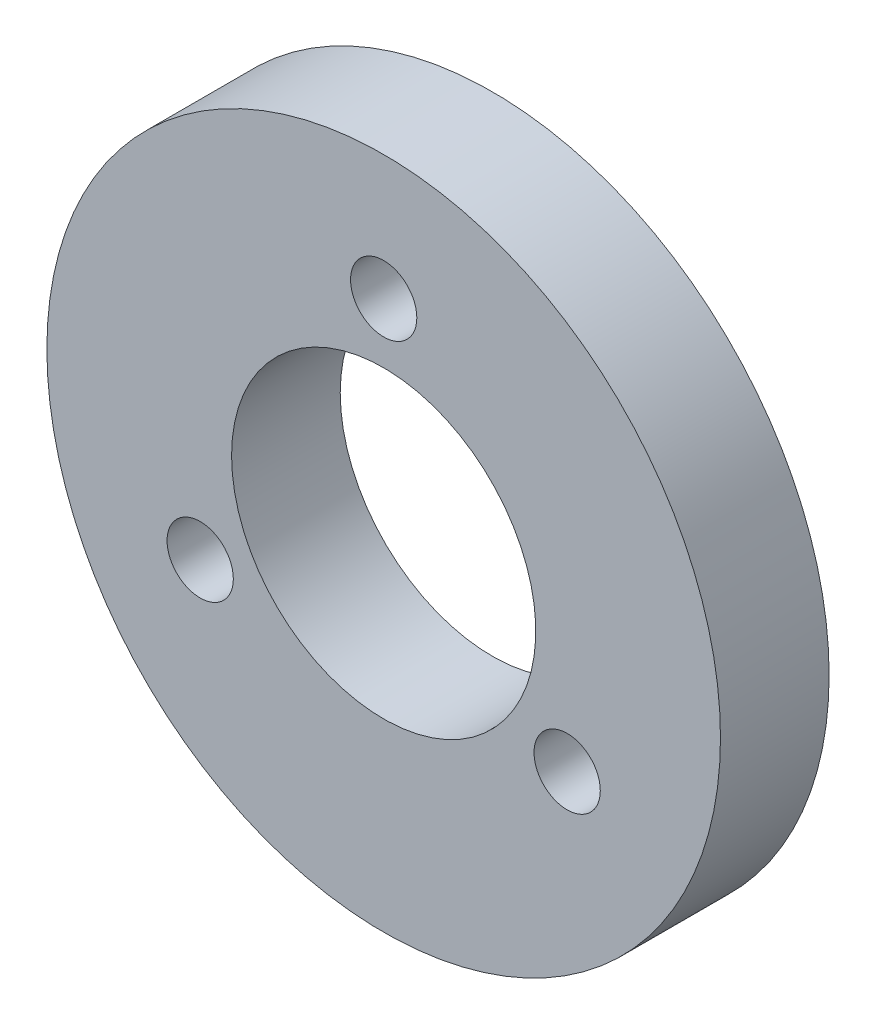
ISO-10303-21;
HEADER;
FILE_DESCRIPTION(('STEP AP214'),'2;1');
FILE_NAME('part.step','',(''),(''),'','','');
FILE_SCHEMA(('AUTOMOTIVE_DESIGN { 1 0 10303 214 1 1 1 1 }'));
ENDSEC;
DATA;
#1=APPLICATION_CONTEXT('core data for automotive mechanical design processes');
#2=APPLICATION_PROTOCOL_DEFINITION('international standard','automotive_design',2000,#1);
#3=PRODUCT_CONTEXT('',#1,'mechanical');
#4=PRODUCT('Part','Part','',(#3));
#5=PRODUCT_RELATED_PRODUCT_CATEGORY('part','',(#4));
#6=PRODUCT_DEFINITION_FORMATION('','',#4);
#7=PRODUCT_DEFINITION_CONTEXT('part definition',#1,'design');
#8=PRODUCT_DEFINITION('design','',#6,#7);
#9=PRODUCT_DEFINITION_SHAPE('','',#8);
#10=(LENGTH_UNIT() NAMED_UNIT(*) SI_UNIT(.MILLI.,.METRE.));
#11=(NAMED_UNIT(*) PLANE_ANGLE_UNIT() SI_UNIT($,.RADIAN.));
#12=(NAMED_UNIT(*) SI_UNIT($,.STERADIAN.) SOLID_ANGLE_UNIT());
#13=UNCERTAINTY_MEASURE_WITH_UNIT(LENGTH_MEASURE(1.E-05),#10,'distance_accuracy_value','');
#14=(GEOMETRIC_REPRESENTATION_CONTEXT(3) GLOBAL_UNCERTAINTY_ASSIGNED_CONTEXT((#13)) GLOBAL_UNIT_ASSIGNED_CONTEXT((#10,
#11,#12)) REPRESENTATION_CONTEXT('',''));
#15=CARTESIAN_POINT('',(0.,0.,0.));
#16=DIRECTION('',(0.,0.,1.));
#17=DIRECTION('',(1.,0.,0.));
#18=AXIS2_PLACEMENT_3D('',#15,#16,#17);
#19=CARTESIAN_POINT('',(0.,0.,5.));
#20=DIRECTION('',(0.,0.,0.999999999999999));
#21=DIRECTION('',(1.,0.,0.));
#22=AXIS2_PLACEMENT_3D('',#19,#20,#21);
#23=PLANE('',#22);
#24=CARTESIAN_POINT('',(2.22044604925031E-13,9.75000000000008,5.00000000000006));
#25=DIRECTION('',(0.,0.,0.999999999999999));
#26=DIRECTION('',(1.,0.,0.));
#27=AXIS2_PLACEMENT_3D('',#24,#25,#26);
#28=CIRCLE('',#27,1.525);
#29=CARTESIAN_POINT('',(1.525,9.75000000000004,5.00000000000006));
#30=VERTEX_POINT('',#29);
#31=EDGE_CURVE('E59',#30,#30,#28,.T.);
#32=ORIENTED_EDGE('',*,*,#31,.F.);
#33=EDGE_LOOP('',(#32));
#34=FACE_BOUND('',#33,.T.);
#35=CARTESIAN_POINT('',(8.44374768689893,-4.8749999999997,5.));
#36=DIRECTION('',(0.,0.,0.999999999999999));
#37=DIRECTION('',(1.,0.,0.));
#38=AXIS2_PLACEMENT_3D('',#35,#36,#37);
#39=CIRCLE('',#38,1.52500000000053);
#40=CARTESIAN_POINT('',(9.96874768689946,-4.87499999999969,5.));
#41=VERTEX_POINT('',#40);
#42=EDGE_CURVE('E52',#41,#41,#39,.T.);
#43=ORIENTED_EDGE('',*,*,#42,.F.);
#44=EDGE_LOOP('',(#43));
#45=FACE_BOUND('',#44,.T.);
#46=CARTESIAN_POINT('',(-8.44374768689771,-4.87500000000031,5.00000000000012));
#47=DIRECTION('',(0.,0.,0.999999999999999));
#48=DIRECTION('',(1.,0.,0.));
#49=AXIS2_PLACEMENT_3D('',#46,#47,#48);
#50=CIRCLE('',#49,1.52500000000079);
#51=CARTESIAN_POINT('',(-6.91874768689714,-4.87500000000041,5.00000000000012));
#52=VERTEX_POINT('',#51);
#53=EDGE_CURVE('E53',#52,#52,#50,.T.);
#54=ORIENTED_EDGE('',*,*,#53,.F.);
#55=EDGE_LOOP('',(#54));
#56=FACE_BOUND('',#55,.T.);
#57=CARTESIAN_POINT('',(0.,0.,5.));
#58=DIRECTION('',(0.,0.,0.999999999999999));
#59=DIRECTION('',(1.,0.,0.));
#60=AXIS2_PLACEMENT_3D('',#57,#58,#59);
#61=CIRCLE('',#60,15.5);
#62=CARTESIAN_POINT('',(-15.5,0.,5.00000000000001));
#63=VERTEX_POINT('',#62);
#64=EDGE_CURVE('E10',#63,#63,#61,.T.);
#65=ORIENTED_EDGE('',*,*,#64,.T.);
#66=EDGE_LOOP('',(#65));
#67=FACE_BOUND('',#66,.T.);
#68=CARTESIAN_POINT('',(0.,0.,5.));
#69=DIRECTION('',(0.,0.,0.999999999999999));
#70=DIRECTION('',(1.,0.,0.));
#71=AXIS2_PLACEMENT_3D('',#68,#69,#70);
#72=CIRCLE('',#71,7.);
#73=CARTESIAN_POINT('',(-7.,0.,5.));
#74=VERTEX_POINT('',#73);
#75=EDGE_CURVE('E41',#74,#74,#72,.T.);
#76=ORIENTED_EDGE('',*,*,#75,.F.);
#77=EDGE_LOOP('',(#76));
#78=FACE_BOUND('',#77,.T.);
#79=ADVANCED_FACE('F30',(#34,#45,#56,#67,#78),#23,.T.);
#80=CARTESIAN_POINT('',(0.,0.,0.));
#81=DIRECTION('',(0.,0.,0.999999999999999));
#82=DIRECTION('',(1.,0.,0.));
#83=AXIS2_PLACEMENT_3D('',#80,#81,#82);
#84=PLANE('',#83);
#85=CARTESIAN_POINT('',(0.,9.75000000000004,1.11022302462516E-13));
#86=DIRECTION('',(0.,0.,0.999999999999999));
#87=DIRECTION('',(1.,0.,0.));
#88=AXIS2_PLACEMENT_3D('',#85,#86,#87);
#89=CIRCLE('',#88,1.525);
#90=CARTESIAN_POINT('',(1.525,9.75000000000004,1.11022302462516E-13));
#91=VERTEX_POINT('',#90);
#92=EDGE_CURVE('E46',#91,#91,#89,.F.);
#93=ORIENTED_EDGE('',*,*,#92,.F.);
#94=EDGE_LOOP('',(#93));
#95=FACE_BOUND('',#94,.T.);
#96=CARTESIAN_POINT('',(8.44374768689893,-4.87499999999969,0.));
#97=DIRECTION('',(0.,0.,0.999999999999999));
#98=DIRECTION('',(1.,0.,0.));
#99=AXIS2_PLACEMENT_3D('',#96,#97,#98);
#100=CIRCLE('',#99,1.52500000000053);
#101=CARTESIAN_POINT('',(9.96874768689946,-4.87499999999969,0.));
#102=VERTEX_POINT('',#101);
#103=EDGE_CURVE('E56',#102,#102,#100,.F.);
#104=ORIENTED_EDGE('',*,*,#103,.F.);
#105=EDGE_LOOP('',(#104));
#106=FACE_BOUND('',#105,.T.);
#107=CARTESIAN_POINT('',(-8.44374768689793,-4.87500000000041,1.11022302462516E-13));
#108=DIRECTION('',(0.,0.,0.999999999999999));
#109=DIRECTION('',(1.,0.,0.));
#110=AXIS2_PLACEMENT_3D('',#107,#108,#109);
#111=CIRCLE('',#110,1.52500000000079);
#112=CARTESIAN_POINT('',(-6.91874768689714,-4.87500000000041,1.11022302462516E-13));
#113=VERTEX_POINT('',#112);
#114=EDGE_CURVE('E49',#113,#113,#111,.F.);
#115=ORIENTED_EDGE('',*,*,#114,.F.);
#116=EDGE_LOOP('',(#115));
#117=FACE_BOUND('',#116,.T.);
#118=CARTESIAN_POINT('',(0.,0.,0.));
#119=DIRECTION('',(0.,0.,0.999999999999999));
#120=DIRECTION('',(1.,0.,0.));
#121=AXIS2_PLACEMENT_3D('',#118,#119,#120);
#122=CIRCLE('',#121,15.5);
#123=CARTESIAN_POINT('',(-15.5,0.,0.));
#124=VERTEX_POINT('',#123);
#125=EDGE_CURVE('E34',#124,#124,#122,.T.);
#126=ORIENTED_EDGE('',*,*,#125,.F.);
#127=EDGE_LOOP('',(#126));
#128=FACE_BOUND('',#127,.T.);
#129=CARTESIAN_POINT('',(0.,0.,0.));
#130=DIRECTION('',(0.,0.,0.999999999999999));
#131=DIRECTION('',(1.,0.,0.));
#132=AXIS2_PLACEMENT_3D('',#129,#130,#131);
#133=CIRCLE('',#132,7.);
#134=CARTESIAN_POINT('',(-7.,0.,0.));
#135=VERTEX_POINT('',#134);
#136=EDGE_CURVE('E43',#135,#135,#133,.T.);
#137=ORIENTED_EDGE('',*,*,#136,.T.);
#138=EDGE_LOOP('',(#137));
#139=FACE_BOUND('',#138,.T.);
#140=ADVANCED_FACE('F72',(#95,#106,#117,#128,#139),#84,.F.);
#141=CARTESIAN_POINT('',(0.,0.,5.));
#142=DIRECTION('',(0.,0.,-0.999999999999999));
#143=DIRECTION('',(-1.,0.,0.));
#144=AXIS2_PLACEMENT_3D('',#141,#142,#143);
#145=CYLINDRICAL_SURFACE('',#144,15.5);
#146=CARTESIAN_POINT('',(-15.5,0.,5.00000000000001));
#147=CARTESIAN_POINT('',(-15.5,0.,4.94791666666667));
#148=CARTESIAN_POINT('',(-15.5,0.,4.89583333333334));
#149=CARTESIAN_POINT('',(-15.5,0.,4.79166666666667));
#150=CARTESIAN_POINT('',(-15.5,0.,4.73958333333334));
#151=CARTESIAN_POINT('',(-15.5,0.,4.63541666666667));
#152=CARTESIAN_POINT('',(-15.5,0.,4.58333333333334));
#153=CARTESIAN_POINT('',(-15.5,0.,4.47916666666667));
#154=CARTESIAN_POINT('',(-15.5,0.,4.42708333333334));
#155=CARTESIAN_POINT('',(-15.5,0.,4.32291666666667));
#156=CARTESIAN_POINT('',(-15.5,0.,4.27083333333334));
#157=CARTESIAN_POINT('',(-15.5,0.,4.16666666666667));
#158=CARTESIAN_POINT('',(-15.5,0.,4.11458333333334));
#159=CARTESIAN_POINT('',(-15.5,0.,4.01041666666667));
#160=CARTESIAN_POINT('',(-15.5,0.,3.95833333333334));
#161=CARTESIAN_POINT('',(-15.5,0.,3.85416666666667));
#162=CARTESIAN_POINT('',(-15.5,0.,3.80208333333334));
#163=CARTESIAN_POINT('',(-15.5,0.,3.69791666666667));
#164=CARTESIAN_POINT('',(-15.5,0.,3.64583333333334));
#165=CARTESIAN_POINT('',(-15.5,0.,3.54166666666667));
#166=CARTESIAN_POINT('',(-15.5,0.,3.48958333333334));
#167=CARTESIAN_POINT('',(-15.5,0.,3.38541666666667));
#168=CARTESIAN_POINT('',(-15.5,0.,3.33333333333334));
#169=CARTESIAN_POINT('',(-15.5,0.,3.22916666666667));
#170=CARTESIAN_POINT('',(-15.5,0.,3.17708333333334));
#171=CARTESIAN_POINT('',(-15.5,0.,3.07291666666667));
#172=CARTESIAN_POINT('',(-15.5,0.,3.02083333333334));
#173=CARTESIAN_POINT('',(-15.5,0.,2.91666666666667));
#174=CARTESIAN_POINT('',(-15.5,0.,2.86458333333334));
#175=CARTESIAN_POINT('',(-15.5,0.,2.76041666666667));
#176=CARTESIAN_POINT('',(-15.5,0.,2.70833333333334));
#177=CARTESIAN_POINT('',(-15.5,0.,2.60416666666667));
#178=CARTESIAN_POINT('',(-15.5,0.,2.55208333333334));
#179=CARTESIAN_POINT('',(-15.5,0.,2.44791666666667));
#180=CARTESIAN_POINT('',(-15.5,0.,2.39583333333334));
#181=CARTESIAN_POINT('',(-15.5,0.,2.29166666666667));
#182=CARTESIAN_POINT('',(-15.5,0.,2.23958333333334));
#183=CARTESIAN_POINT('',(-15.5,0.,2.13541666666667));
#184=CARTESIAN_POINT('',(-15.5,0.,2.08333333333334));
#185=CARTESIAN_POINT('',(-15.5,0.,1.97916666666667));
#186=CARTESIAN_POINT('',(-15.5,0.,1.92708333333333));
#187=CARTESIAN_POINT('',(-15.5,0.,1.82291666666667));
#188=CARTESIAN_POINT('',(-15.5,0.,1.77083333333333));
#189=CARTESIAN_POINT('',(-15.5,0.,1.66666666666667));
#190=CARTESIAN_POINT('',(-15.5,0.,1.61458333333333));
#191=CARTESIAN_POINT('',(-15.5,0.,1.51041666666667));
#192=CARTESIAN_POINT('',(-15.5,0.,1.45833333333333));
#193=CARTESIAN_POINT('',(-15.5,0.,1.35416666666667));
#194=CARTESIAN_POINT('',(-15.5,0.,1.30208333333333));
#195=CARTESIAN_POINT('',(-15.5,0.,1.19791666666667));
#196=CARTESIAN_POINT('',(-15.5,0.,1.14583333333333));
#197=CARTESIAN_POINT('',(-15.5,0.,1.04166666666667));
#198=CARTESIAN_POINT('',(-15.5,0.,0.989583333333334));
#199=CARTESIAN_POINT('',(-15.5,0.,0.885416666666667));
#200=CARTESIAN_POINT('',(-15.5,0.,0.833333333333333));
#201=CARTESIAN_POINT('',(-15.5,0.,0.729166666666667));
#202=CARTESIAN_POINT('',(-15.5,0.,0.677083333333334));
#203=CARTESIAN_POINT('',(-15.5,0.,0.572916666666667));
#204=CARTESIAN_POINT('',(-15.5,0.,0.520833333333334));
#205=CARTESIAN_POINT('',(-15.5,0.,0.416666666666667));
#206=CARTESIAN_POINT('',(-15.5,0.,0.364583333333334));
#207=CARTESIAN_POINT('',(-15.5,0.,0.260416666666667));
#208=CARTESIAN_POINT('',(-15.5,0.,0.208333333333333));
#209=CARTESIAN_POINT('',(-15.5,0.,0.104166666666666));
#210=CARTESIAN_POINT('',(-15.5,0.,0.0520833333333331));
#211=CARTESIAN_POINT('',(-15.5,0.,0.));
#212=B_SPLINE_CURVE_WITH_KNOTS('',3,(#146,#147,#148,#149,#150,#151,#152,#153,#154,#155,#156,
#157,#158,#159,#160,#161,#162,#163,#164,#165,#166,#167,#168,#169,#170,#171,#172,#173,#174,#175,
#176,#177,#178,#179,#180,#181,#182,#183,#184,#185,#186,#187,#188,#189,#190,#191,#192,#193,#194,
#195,#196,#197,#198,#199,#200,#201,#202,#203,#204,#205,#206,#207,#208,#209,#210,#211),
.UNSPECIFIED.,.F.,.F.,(4,2,2,2,2,2,2,2,2,2,2,2,2,2,2,2,2,2,2,2,2,2,2,2,2,2,2,2,2,2,2,2,4),(0.,
0.156250000000001,0.312500000000001,0.468750000000001,0.625000000000001,0.781250000000002,
0.937500000000002,1.09375,1.25,1.40625,1.5625,1.71875,1.875,2.03125,2.1875,2.34375,2.5,2.65625,
2.8125,2.96875,3.125,3.28125,3.4375,3.59375,3.75,3.90625,4.0625,4.21875000000001,4.375,
4.53125000000001,4.68750000000001,4.84375000000001,5.00000000000001),.UNSPECIFIED.);
#213=EDGE_CURVE('BSEAM32',#63,#124,#212,.T.);
#214=ORIENTED_EDGE('',*,*,#64,.F.);
#215=ORIENTED_EDGE('',*,*,#125,.T.);
#216=ORIENTED_EDGE('',*,*,#213,.T.);
#217=ORIENTED_EDGE('',*,*,#213,.F.);
#218=EDGE_LOOP('',(#214,#216,#215,#217));
#219=FACE_BOUND('',#218,.T.);
#220=ADVANCED_FACE('F32',(#219),#145,.T.);
#221=CARTESIAN_POINT('',(0.,0.,5.));
#222=DIRECTION('',(0.,0.,-0.999999999999999));
#223=DIRECTION('',(-1.,0.,0.));
#224=AXIS2_PLACEMENT_3D('',#221,#222,#223);
#225=CYLINDRICAL_SURFACE('',#224,7.);
#226=CARTESIAN_POINT('',(-7.,0.,5.));
#227=CARTESIAN_POINT('',(-7.,0.,4.94791666666667));
#228=CARTESIAN_POINT('',(-7.,0.,4.89583333333334));
#229=CARTESIAN_POINT('',(-7.,0.,4.79166666666667));
#230=CARTESIAN_POINT('',(-7.,0.,4.73958333333334));
#231=CARTESIAN_POINT('',(-7.,0.,4.63541666666667));
#232=CARTESIAN_POINT('',(-7.,0.,4.58333333333334));
#233=CARTESIAN_POINT('',(-7.,0.,4.47916666666667));
#234=CARTESIAN_POINT('',(-7.,0.,4.42708333333334));
#235=CARTESIAN_POINT('',(-7.,0.,4.32291666666667));
#236=CARTESIAN_POINT('',(-7.,0.,4.27083333333334));
#237=CARTESIAN_POINT('',(-7.,0.,4.16666666666667));
#238=CARTESIAN_POINT('',(-7.,0.,4.11458333333334));
#239=CARTESIAN_POINT('',(-7.,0.,4.01041666666667));
#240=CARTESIAN_POINT('',(-7.,0.,3.95833333333334));
#241=CARTESIAN_POINT('',(-7.,0.,3.85416666666667));
#242=CARTESIAN_POINT('',(-7.,0.,3.80208333333334));
#243=CARTESIAN_POINT('',(-7.,0.,3.69791666666667));
#244=CARTESIAN_POINT('',(-7.,0.,3.64583333333334));
#245=CARTESIAN_POINT('',(-7.,0.,3.54166666666667));
#246=CARTESIAN_POINT('',(-7.,0.,3.48958333333334));
#247=CARTESIAN_POINT('',(-7.,0.,3.38541666666667));
#248=CARTESIAN_POINT('',(-7.,0.,3.33333333333334));
#249=CARTESIAN_POINT('',(-7.,0.,3.22916666666667));
#250=CARTESIAN_POINT('',(-7.,0.,3.17708333333334));
#251=CARTESIAN_POINT('',(-7.,0.,3.07291666666667));
#252=CARTESIAN_POINT('',(-7.,0.,3.02083333333334));
#253=CARTESIAN_POINT('',(-7.,0.,2.91666666666667));
#254=CARTESIAN_POINT('',(-7.,0.,2.86458333333334));
#255=CARTESIAN_POINT('',(-7.,0.,2.76041666666667));
#256=CARTESIAN_POINT('',(-7.,0.,2.70833333333334));
#257=CARTESIAN_POINT('',(-7.,0.,2.60416666666667));
#258=CARTESIAN_POINT('',(-7.,0.,2.55208333333334));
#259=CARTESIAN_POINT('',(-7.,0.,2.44791666666667));
#260=CARTESIAN_POINT('',(-7.,0.,2.39583333333334));
#261=CARTESIAN_POINT('',(-7.,0.,2.29166666666667));
#262=CARTESIAN_POINT('',(-7.,0.,2.23958333333334));
#263=CARTESIAN_POINT('',(-7.,0.,2.13541666666667));
#264=CARTESIAN_POINT('',(-7.,0.,2.08333333333334));
#265=CARTESIAN_POINT('',(-7.,0.,1.97916666666667));
#266=CARTESIAN_POINT('',(-7.,0.,1.92708333333334));
#267=CARTESIAN_POINT('',(-7.,0.,1.82291666666667));
#268=CARTESIAN_POINT('',(-7.,0.,1.77083333333334));
#269=CARTESIAN_POINT('',(-7.,0.,1.66666666666667));
#270=CARTESIAN_POINT('',(-7.,0.,1.61458333333334));
#271=CARTESIAN_POINT('',(-7.,0.,1.51041666666667));
#272=CARTESIAN_POINT('',(-7.,0.,1.45833333333333));
#273=CARTESIAN_POINT('',(-7.,0.,1.35416666666667));
#274=CARTESIAN_POINT('',(-7.,0.,1.30208333333333));
#275=CARTESIAN_POINT('',(-7.,0.,1.19791666666667));
#276=CARTESIAN_POINT('',(-7.,0.,1.14583333333333));
#277=CARTESIAN_POINT('',(-7.,0.,1.04166666666667));
#278=CARTESIAN_POINT('',(-7.,0.,0.989583333333334));
#279=CARTESIAN_POINT('',(-7.,0.,0.885416666666667));
#280=CARTESIAN_POINT('',(-7.,0.,0.833333333333333));
#281=CARTESIAN_POINT('',(-7.,0.,0.729166666666667));
#282=CARTESIAN_POINT('',(-7.,0.,0.677083333333334));
#283=CARTESIAN_POINT('',(-7.,0.,0.572916666666667));
#284=CARTESIAN_POINT('',(-7.,0.,0.520833333333334));
#285=CARTESIAN_POINT('',(-7.,0.,0.416666666666667));
#286=CARTESIAN_POINT('',(-7.,0.,0.364583333333333));
#287=CARTESIAN_POINT('',(-7.,0.,0.260416666666666));
#288=CARTESIAN_POINT('',(-7.,0.,0.208333333333333));
#289=CARTESIAN_POINT('',(-7.,0.,0.104166666666666));
#290=CARTESIAN_POINT('',(-7.,0.,0.052083333333333));
#291=CARTESIAN_POINT('',(-7.,0.,0.));
#292=B_SPLINE_CURVE_WITH_KNOTS('',3,(#226,#227,#228,#229,#230,#231,#232,#233,#234,#235,#236,
#237,#238,#239,#240,#241,#242,#243,#244,#245,#246,#247,#248,#249,#250,#251,#252,#253,#254,#255,
#256,#257,#258,#259,#260,#261,#262,#263,#264,#265,#266,#267,#268,#269,#270,#271,#272,#273,#274,
#275,#276,#277,#278,#279,#280,#281,#282,#283,#284,#285,#286,#287,#288,#289,#290,#291),
.UNSPECIFIED.,.F.,.F.,(4,2,2,2,2,2,2,2,2,2,2,2,2,2,2,2,2,2,2,2,2,2,2,2,2,2,2,2,2,2,2,2,4),(0.,
0.15625,0.3125,0.46875,0.625000000000001,0.781250000000001,0.937500000000001,1.09375,1.25,
1.40625,1.5625,1.71875,1.875,2.03125,2.1875,2.34375,2.5,2.65625,2.8125,2.96875,3.125,3.28125,
3.4375,3.59375,3.75,3.90625,4.0625,4.21875,4.375,4.53125,4.68750000000001,4.84375000000001,5.),.UNSPECIFIED.);
#293=EDGE_CURVE('BSEAM80',#74,#135,#292,.T.);
#294=ORIENTED_EDGE('',*,*,#75,.T.);
#295=ORIENTED_EDGE('',*,*,#136,.F.);
#296=ORIENTED_EDGE('',*,*,#293,.T.);
#297=ORIENTED_EDGE('',*,*,#293,.F.);
#298=EDGE_LOOP('',(#294,#296,#295,#297));
#299=FACE_BOUND('',#298,.T.);
#300=ADVANCED_FACE('F80',(#299),#225,.F.);
#301=CARTESIAN_POINT('',(-8.44374768689793,-4.87500000000041,-0.000999999999917733));
#302=DIRECTION('',(0.,0.,0.999999999999999));
#303=DIRECTION('',(1.,0.,0.));
#304=AXIS2_PLACEMENT_3D('',#301,#302,#303);
#305=CYLINDRICAL_SURFACE('',#304,1.52500000000079);
#306=CARTESIAN_POINT('',(-6.91874768689714,-4.87500000000041,5.00000000000012));
#307=CARTESIAN_POINT('',(-6.91874768689714,-4.87500000000041,4.94791666666678));
#308=CARTESIAN_POINT('',(-6.91874768689714,-4.87500000000041,4.89583333333345));
#309=CARTESIAN_POINT('',(-6.91874768689714,-4.87500000000041,4.79166666666678));
#310=CARTESIAN_POINT('',(-6.91874768689714,-4.87500000000041,4.73958333333345));
#311=CARTESIAN_POINT('',(-6.91874768689714,-4.87500000000041,4.63541666666678));
#312=CARTESIAN_POINT('',(-6.91874768689714,-4.87500000000041,4.58333333333345));
#313=CARTESIAN_POINT('',(-6.91874768689714,-4.87500000000041,4.47916666666678));
#314=CARTESIAN_POINT('',(-6.91874768689714,-4.87500000000041,4.42708333333345));
#315=CARTESIAN_POINT('',(-6.91874768689714,-4.87500000000041,4.32291666666678));
#316=CARTESIAN_POINT('',(-6.91874768689714,-4.87500000000041,4.27083333333345));
#317=CARTESIAN_POINT('',(-6.91874768689714,-4.87500000000041,4.16666666666678));
#318=CARTESIAN_POINT('',(-6.91874768689714,-4.87500000000041,4.11458333333345));
#319=CARTESIAN_POINT('',(-6.91874768689714,-4.87500000000041,4.01041666666678));
#320=CARTESIAN_POINT('',(-6.91874768689714,-4.87500000000041,3.95833333333345));
#321=CARTESIAN_POINT('',(-6.91874768689714,-4.87500000000041,3.85416666666678));
#322=CARTESIAN_POINT('',(-6.91874768689714,-4.87500000000041,3.80208333333345));
#323=CARTESIAN_POINT('',(-6.91874768689714,-4.87500000000041,3.69791666666678));
#324=CARTESIAN_POINT('',(-6.91874768689714,-4.87500000000041,3.64583333333345));
#325=CARTESIAN_POINT('',(-6.91874768689714,-4.87500000000041,3.54166666666678));
#326=CARTESIAN_POINT('',(-6.91874768689714,-4.87500000000041,3.48958333333345));
#327=CARTESIAN_POINT('',(-6.91874768689714,-4.87500000000041,3.38541666666678));
#328=CARTESIAN_POINT('',(-6.91874768689714,-4.87500000000041,3.33333333333345));
#329=CARTESIAN_POINT('',(-6.91874768689714,-4.87500000000041,3.22916666666678));
#330=CARTESIAN_POINT('',(-6.91874768689714,-4.87500000000041,3.17708333333345));
#331=CARTESIAN_POINT('',(-6.91874768689714,-4.87500000000041,3.07291666666678));
#332=CARTESIAN_POINT('',(-6.91874768689714,-4.87500000000041,3.02083333333345));
#333=CARTESIAN_POINT('',(-6.91874768689714,-4.87500000000041,2.91666666666678));
#334=CARTESIAN_POINT('',(-6.91874768689714,-4.87500000000041,2.86458333333345));
#335=CARTESIAN_POINT('',(-6.91874768689714,-4.87500000000041,2.76041666666678));
#336=CARTESIAN_POINT('',(-6.91874768689714,-4.87500000000041,2.70833333333345));
#337=CARTESIAN_POINT('',(-6.91874768689714,-4.87500000000041,2.60416666666678));
#338=CARTESIAN_POINT('',(-6.91874768689714,-4.87500000000041,2.55208333333345));
#339=CARTESIAN_POINT('',(-6.91874768689714,-4.87500000000041,2.44791666666678));
#340=CARTESIAN_POINT('',(-6.91874768689714,-4.87500000000041,2.39583333333345));
#341=CARTESIAN_POINT('',(-6.91874768689714,-4.87500000000041,2.29166666666678));
#342=CARTESIAN_POINT('',(-6.91874768689714,-4.87500000000041,2.23958333333345));
#343=CARTESIAN_POINT('',(-6.91874768689714,-4.87500000000041,2.13541666666678));
#344=CARTESIAN_POINT('',(-6.91874768689714,-4.87500000000041,2.08333333333345));
#345=CARTESIAN_POINT('',(-6.91874768689714,-4.87500000000041,1.97916666666678));
#346=CARTESIAN_POINT('',(-6.91874768689714,-4.87500000000041,1.92708333333345));
#347=CARTESIAN_POINT('',(-6.91874768689714,-4.87500000000041,1.82291666666678));
#348=CARTESIAN_POINT('',(-6.91874768689714,-4.87500000000041,1.77083333333345));
#349=CARTESIAN_POINT('',(-6.91874768689714,-4.87500000000041,1.66666666666678));
#350=CARTESIAN_POINT('',(-6.91874768689714,-4.87500000000041,1.61458333333345));
#351=CARTESIAN_POINT('',(-6.91874768689714,-4.87500000000041,1.51041666666678));
#352=CARTESIAN_POINT('',(-6.91874768689714,-4.87500000000041,1.45833333333345));
#353=CARTESIAN_POINT('',(-6.91874768689714,-4.87500000000041,1.35416666666678));
#354=CARTESIAN_POINT('',(-6.91874768689714,-4.87500000000041,1.30208333333345));
#355=CARTESIAN_POINT('',(-6.91874768689714,-4.87500000000041,1.19791666666678));
#356=CARTESIAN_POINT('',(-6.91874768689714,-4.87500000000041,1.14583333333345));
#357=CARTESIAN_POINT('',(-6.91874768689714,-4.87500000000041,1.04166666666678));
#358=CARTESIAN_POINT('',(-6.91874768689714,-4.87500000000041,0.989583333333446));
#359=CARTESIAN_POINT('',(-6.91874768689714,-4.87500000000041,0.885416666666779));
#360=CARTESIAN_POINT('',(-6.91874768689714,-4.87500000000041,0.833333333333445));
#361=CARTESIAN_POINT('',(-6.91874768689714,-4.87500000000041,0.729166666666778));
#362=CARTESIAN_POINT('',(-6.91874768689714,-4.87500000000041,0.677083333333445));
#363=CARTESIAN_POINT('',(-6.91874768689714,-4.87500000000041,0.572916666666778));
#364=CARTESIAN_POINT('',(-6.91874768689714,-4.87500000000041,0.520833333333445));
#365=CARTESIAN_POINT('',(-6.91874768689714,-4.87500000000041,0.416666666666778));
#366=CARTESIAN_POINT('',(-6.91874768689714,-4.87500000000041,0.364583333333444));
#367=CARTESIAN_POINT('',(-6.91874768689714,-4.87500000000041,0.260416666666778));
#368=CARTESIAN_POINT('',(-6.91874768689714,-4.87500000000041,0.208333333333444));
#369=CARTESIAN_POINT('',(-6.91874768689714,-4.87500000000041,0.104166666666778));
#370=CARTESIAN_POINT('',(-6.91874768689714,-4.87500000000041,0.0520833333334444));
#371=CARTESIAN_POINT('',(-6.91874768689714,-4.87500000000041,1.11021031913095E-13));
#372=B_SPLINE_CURVE_WITH_KNOTS('',3,(#306,#307,#308,#309,#310,#311,#312,#313,#314,#315,#316,
#317,#318,#319,#320,#321,#322,#323,#324,#325,#326,#327,#328,#329,#330,#331,#332,#333,#334,#335,
#336,#337,#338,#339,#340,#341,#342,#343,#344,#345,#346,#347,#348,#349,#350,#351,#352,#353,#354,
#355,#356,#357,#358,#359,#360,#361,#362,#363,#364,#365,#366,#367,#368,#369,#370,#371),
.UNSPECIFIED.,.F.,.F.,(4,2,2,2,2,2,2,2,2,2,2,2,2,2,2,2,2,2,2,2,2,2,2,2,2,2,2,2,2,2,2,2,4),(0.,
0.156249999999999,0.312499999999999,0.46875,0.625000000000001,0.78125,0.937500000000001,1.09375,
1.25,1.40625,1.5625,1.71875,1.875,2.03125,2.1875,2.34375,2.5,2.65625,2.8125,2.96875,3.125,
3.28125,3.4375,3.59375,3.75,3.90625,4.0625,4.21875,4.375,4.53125000000001,4.68750000000001,
4.84375000000001,5.00000000000001),.UNSPECIFIED.);
#373=EDGE_CURVE('BSEAM83',#52,#113,#372,.T.);
#374=ORIENTED_EDGE('',*,*,#53,.T.);
#375=ORIENTED_EDGE('',*,*,#114,.T.);
#376=ORIENTED_EDGE('',*,*,#373,.T.);
#377=ORIENTED_EDGE('',*,*,#373,.F.);
#378=EDGE_LOOP('',(#374,#376,#375,#377));
#379=FACE_BOUND('',#378,.T.);
#380=ADVANCED_FACE('F83',(#379),#305,.F.);
#381=CARTESIAN_POINT('',(8.44374768689893,-4.87499999999969,-0.00100000000002876));
#382=DIRECTION('',(0.,0.,0.999999999999999));
#383=DIRECTION('',(1.,0.,0.));
#384=AXIS2_PLACEMENT_3D('',#381,#382,#383);
#385=CYLINDRICAL_SURFACE('',#384,1.52500000000053);
#386=CARTESIAN_POINT('',(9.96874768689946,-4.87499999999969,5.));
#387=CARTESIAN_POINT('',(9.96874768689946,-4.87499999999969,4.94791666666667));
#388=CARTESIAN_POINT('',(9.96874768689946,-4.87499999999969,4.89583333333334));
#389=CARTESIAN_POINT('',(9.96874768689946,-4.87499999999969,4.79166666666667));
#390=CARTESIAN_POINT('',(9.96874768689946,-4.87499999999969,4.73958333333334));
#391=CARTESIAN_POINT('',(9.96874768689946,-4.87499999999969,4.63541666666667));
#392=CARTESIAN_POINT('',(9.96874768689946,-4.87499999999969,4.58333333333334));
#393=CARTESIAN_POINT('',(9.96874768689946,-4.87499999999969,4.47916666666667));
#394=CARTESIAN_POINT('',(9.96874768689946,-4.87499999999969,4.42708333333334));
#395=CARTESIAN_POINT('',(9.96874768689946,-4.87499999999969,4.32291666666667));
#396=CARTESIAN_POINT('',(9.96874768689946,-4.87499999999969,4.27083333333334));
#397=CARTESIAN_POINT('',(9.96874768689946,-4.87499999999969,4.16666666666667));
#398=CARTESIAN_POINT('',(9.96874768689946,-4.87499999999969,4.11458333333334));
#399=CARTESIAN_POINT('',(9.96874768689946,-4.87499999999969,4.01041666666667));
#400=CARTESIAN_POINT('',(9.96874768689946,-4.87499999999969,3.95833333333334));
#401=CARTESIAN_POINT('',(9.96874768689946,-4.87499999999969,3.85416666666667));
#402=CARTESIAN_POINT('',(9.96874768689946,-4.87499999999969,3.80208333333334));
#403=CARTESIAN_POINT('',(9.96874768689946,-4.87499999999969,3.69791666666667));
#404=CARTESIAN_POINT('',(9.96874768689946,-4.87499999999969,3.64583333333334));
#405=CARTESIAN_POINT('',(9.96874768689946,-4.87499999999969,3.54166666666667));
#406=CARTESIAN_POINT('',(9.96874768689946,-4.87499999999969,3.48958333333334));
#407=CARTESIAN_POINT('',(9.96874768689946,-4.87499999999969,3.38541666666667));
#408=CARTESIAN_POINT('',(9.96874768689946,-4.87499999999969,3.33333333333334));
#409=CARTESIAN_POINT('',(9.96874768689946,-4.87499999999969,3.22916666666667));
#410=CARTESIAN_POINT('',(9.96874768689946,-4.87499999999969,3.17708333333334));
#411=CARTESIAN_POINT('',(9.96874768689946,-4.87499999999969,3.07291666666667));
#412=CARTESIAN_POINT('',(9.96874768689946,-4.87499999999969,3.02083333333334));
#413=CARTESIAN_POINT('',(9.96874768689946,-4.87499999999969,2.91666666666667));
#414=CARTESIAN_POINT('',(9.96874768689946,-4.87499999999969,2.86458333333334));
#415=CARTESIAN_POINT('',(9.96874768689946,-4.87499999999969,2.76041666666667));
#416=CARTESIAN_POINT('',(9.96874768689946,-4.87499999999969,2.70833333333334));
#417=CARTESIAN_POINT('',(9.96874768689946,-4.87499999999969,2.60416666666667));
#418=CARTESIAN_POINT('',(9.96874768689946,-4.87499999999969,2.55208333333334));
#419=CARTESIAN_POINT('',(9.96874768689946,-4.87499999999969,2.44791666666667));
#420=CARTESIAN_POINT('',(9.96874768689946,-4.87499999999969,2.39583333333334));
#421=CARTESIAN_POINT('',(9.96874768689946,-4.87499999999969,2.29166666666667));
#422=CARTESIAN_POINT('',(9.96874768689946,-4.87499999999969,2.23958333333334));
#423=CARTESIAN_POINT('',(9.96874768689946,-4.87499999999969,2.13541666666667));
#424=CARTESIAN_POINT('',(9.96874768689946,-4.87499999999969,2.08333333333334));
#425=CARTESIAN_POINT('',(9.96874768689946,-4.87499999999969,1.97916666666667));
#426=CARTESIAN_POINT('',(9.96874768689946,-4.87499999999969,1.92708333333334));
#427=CARTESIAN_POINT('',(9.96874768689946,-4.87499999999969,1.82291666666667));
#428=CARTESIAN_POINT('',(9.96874768689946,-4.87499999999969,1.77083333333334));
#429=CARTESIAN_POINT('',(9.96874768689946,-4.87499999999969,1.66666666666667));
#430=CARTESIAN_POINT('',(9.96874768689946,-4.87499999999969,1.61458333333333));
#431=CARTESIAN_POINT('',(9.96874768689946,-4.87499999999969,1.51041666666667));
#432=CARTESIAN_POINT('',(9.96874768689946,-4.87499999999969,1.45833333333333));
#433=CARTESIAN_POINT('',(9.96874768689946,-4.87499999999969,1.35416666666667));
#434=CARTESIAN_POINT('',(9.96874768689946,-4.87499999999969,1.30208333333333));
#435=CARTESIAN_POINT('',(9.96874768689946,-4.87499999999969,1.19791666666667));
#436=CARTESIAN_POINT('',(9.96874768689946,-4.87499999999969,1.14583333333333));
#437=CARTESIAN_POINT('',(9.96874768689946,-4.87499999999969,1.04166666666667));
#438=CARTESIAN_POINT('',(9.96874768689946,-4.87499999999969,0.989583333333334));
#439=CARTESIAN_POINT('',(9.96874768689946,-4.87499999999969,0.885416666666668));
#440=CARTESIAN_POINT('',(9.96874768689946,-4.87499999999969,0.833333333333334));
#441=CARTESIAN_POINT('',(9.96874768689946,-4.87499999999969,0.729166666666667));
#442=CARTESIAN_POINT('',(9.96874768689946,-4.87499999999969,0.677083333333334));
#443=CARTESIAN_POINT('',(9.96874768689946,-4.87499999999969,0.572916666666667));
#444=CARTESIAN_POINT('',(9.96874768689946,-4.87499999999969,0.520833333333334));
#445=CARTESIAN_POINT('',(9.96874768689946,-4.87499999999969,0.416666666666667));
#446=CARTESIAN_POINT('',(9.96874768689946,-4.87499999999969,0.364583333333333));
#447=CARTESIAN_POINT('',(9.96874768689946,-4.87499999999969,0.260416666666667));
#448=CARTESIAN_POINT('',(9.96874768689946,-4.87499999999969,0.208333333333333));
#449=CARTESIAN_POINT('',(9.96874768689946,-4.87499999999969,0.104166666666667));
#450=CARTESIAN_POINT('',(9.96874768689946,-4.87499999999969,0.0520833333333334));
#451=CARTESIAN_POINT('',(9.96874768689946,-4.87499999999969,0.));
#452=B_SPLINE_CURVE_WITH_KNOTS('',3,(#386,#387,#388,#389,#390,#391,#392,#393,#394,#395,#396,
#397,#398,#399,#400,#401,#402,#403,#404,#405,#406,#407,#408,#409,#410,#411,#412,#413,#414,#415,
#416,#417,#418,#419,#420,#421,#422,#423,#424,#425,#426,#427,#428,#429,#430,#431,#432,#433,#434,
#435,#436,#437,#438,#439,#440,#441,#442,#443,#444,#445,#446,#447,#448,#449,#450,#451),
.UNSPECIFIED.,.F.,.F.,(4,2,2,2,2,2,2,2,2,2,2,2,2,2,2,2,2,2,2,2,2,2,2,2,2,2,2,2,2,2,2,2,4),(0.,
0.156249999999999,0.312499999999999,0.46875,0.625000000000001,0.78125,0.937500000000001,1.09375,
1.25,1.40625,1.5625,1.71875,1.875,2.03125,2.1875,2.34375,2.5,2.65625,2.8125,2.96875,3.125,
3.28125,3.4375,3.59375,3.75,3.90625,4.0625,4.21875,4.375,4.53125000000001,4.68750000000001,
4.84375000000001,5.00000000000001),.UNSPECIFIED.);
#453=EDGE_CURVE('BSEAM98',#41,#102,#452,.T.);
#454=ORIENTED_EDGE('',*,*,#42,.T.);
#455=ORIENTED_EDGE('',*,*,#103,.T.);
#456=ORIENTED_EDGE('',*,*,#453,.T.);
#457=ORIENTED_EDGE('',*,*,#453,.F.);
#458=EDGE_LOOP('',(#454,#456,#455,#457));
#459=FACE_BOUND('',#458,.T.);
#460=ADVANCED_FACE('F98',(#459),#385,.F.);
#461=CARTESIAN_POINT('',(0.,9.75000000000004,-0.000999999999917733));
#462=DIRECTION('',(0.,0.,0.999999999999999));
#463=DIRECTION('',(1.,0.,0.));
#464=AXIS2_PLACEMENT_3D('',#461,#462,#463);
#465=CYLINDRICAL_SURFACE('',#464,1.525);
#466=CARTESIAN_POINT('',(1.525,9.75000000000004,5.00000000000006));
#467=CARTESIAN_POINT('',(1.525,9.75000000000004,4.94791666666673));
#468=CARTESIAN_POINT('',(1.525,9.75000000000004,4.8958333333334));
#469=CARTESIAN_POINT('',(1.525,9.75000000000004,4.79166666666673));
#470=CARTESIAN_POINT('',(1.525,9.75000000000004,4.7395833333334));
#471=CARTESIAN_POINT('',(1.525,9.75000000000004,4.63541666666673));
#472=CARTESIAN_POINT('',(1.525,9.75000000000004,4.5833333333334));
#473=CARTESIAN_POINT('',(1.525,9.75000000000004,4.47916666666673));
#474=CARTESIAN_POINT('',(1.525,9.75000000000004,4.4270833333334));
#475=CARTESIAN_POINT('',(1.525,9.75000000000004,4.32291666666673));
#476=CARTESIAN_POINT('',(1.525,9.75000000000004,4.2708333333334));
#477=CARTESIAN_POINT('',(1.525,9.75000000000004,4.16666666666674));
#478=CARTESIAN_POINT('',(1.525,9.75000000000004,4.1145833333334));
#479=CARTESIAN_POINT('',(1.525,9.75000000000004,4.01041666666674));
#480=CARTESIAN_POINT('',(1.525,9.75000000000004,3.9583333333334));
#481=CARTESIAN_POINT('',(1.525,9.75000000000004,3.85416666666674));
#482=CARTESIAN_POINT('',(1.525,9.75000000000004,3.80208333333341));
#483=CARTESIAN_POINT('',(1.525,9.75000000000004,3.69791666666674));
#484=CARTESIAN_POINT('',(1.525,9.75000000000004,3.64583333333341));
#485=CARTESIAN_POINT('',(1.525,9.75000000000004,3.54166666666674));
#486=CARTESIAN_POINT('',(1.525,9.75000000000004,3.48958333333341));
#487=CARTESIAN_POINT('',(1.525,9.75000000000004,3.38541666666674));
#488=CARTESIAN_POINT('',(1.525,9.75000000000004,3.33333333333341));
#489=CARTESIAN_POINT('',(1.525,9.75000000000004,3.22916666666674));
#490=CARTESIAN_POINT('',(1.525,9.75000000000004,3.17708333333341));
#491=CARTESIAN_POINT('',(1.525,9.75000000000004,3.07291666666675));
#492=CARTESIAN_POINT('',(1.525,9.75000000000004,3.02083333333341));
#493=CARTESIAN_POINT('',(1.525,9.75000000000004,2.91666666666675));
#494=CARTESIAN_POINT('',(1.525,9.75000000000004,2.86458333333342));
#495=CARTESIAN_POINT('',(1.525,9.75000000000004,2.76041666666675));
#496=CARTESIAN_POINT('',(1.525,9.75000000000004,2.70833333333342));
#497=CARTESIAN_POINT('',(1.525,9.75000000000004,2.60416666666675));
#498=CARTESIAN_POINT('',(1.525,9.75000000000004,2.55208333333342));
#499=CARTESIAN_POINT('',(1.525,9.75000000000004,2.44791666666675));
#500=CARTESIAN_POINT('',(1.525,9.75000000000004,2.39583333333342));
#501=CARTESIAN_POINT('',(1.525,9.75000000000004,2.29166666666675));
#502=CARTESIAN_POINT('',(1.525,9.75000000000004,2.23958333333342));
#503=CARTESIAN_POINT('',(1.525,9.75000000000004,2.13541666666676));
#504=CARTESIAN_POINT('',(1.525,9.75000000000004,2.08333333333342));
#505=CARTESIAN_POINT('',(1.525,9.75000000000004,1.97916666666676));
#506=CARTESIAN_POINT('',(1.525,9.75000000000004,1.92708333333342));
#507=CARTESIAN_POINT('',(1.525,9.75000000000004,1.82291666666676));
#508=CARTESIAN_POINT('',(1.525,9.75000000000004,1.77083333333343));
#509=CARTESIAN_POINT('',(1.525,9.75000000000004,1.66666666666676));
#510=CARTESIAN_POINT('',(1.525,9.75000000000004,1.61458333333343));
#511=CARTESIAN_POINT('',(1.525,9.75000000000004,1.51041666666676));
#512=CARTESIAN_POINT('',(1.525,9.75000000000004,1.45833333333343));
#513=CARTESIAN_POINT('',(1.525,9.75000000000004,1.35416666666676));
#514=CARTESIAN_POINT('',(1.525,9.75000000000004,1.30208333333343));
#515=CARTESIAN_POINT('',(1.525,9.75000000000004,1.19791666666677));
#516=CARTESIAN_POINT('',(1.525,9.75000000000004,1.14583333333343));
#517=CARTESIAN_POINT('',(1.525,9.75000000000004,1.04166666666677));
#518=CARTESIAN_POINT('',(1.525,9.75000000000004,0.989583333333435));
#519=CARTESIAN_POINT('',(1.525,9.75000000000004,0.885416666666769));
#520=CARTESIAN_POINT('',(1.525,9.75000000000004,0.833333333333436));
#521=CARTESIAN_POINT('',(1.525,9.75000000000004,0.72916666666677));
#522=CARTESIAN_POINT('',(1.525,9.75000000000004,0.677083333333437));
#523=CARTESIAN_POINT('',(1.525,9.75000000000004,0.572916666666772));
#524=CARTESIAN_POINT('',(1.525,9.75000000000004,0.520833333333439));
#525=CARTESIAN_POINT('',(1.525,9.75000000000004,0.416666666666773));
#526=CARTESIAN_POINT('',(1.525,9.75000000000004,0.36458333333344));
#527=CARTESIAN_POINT('',(1.525,9.75000000000004,0.260416666666775));
#528=CARTESIAN_POINT('',(1.525,9.75000000000004,0.208333333333442));
#529=CARTESIAN_POINT('',(1.525,9.75000000000004,0.104166666666776));
#530=CARTESIAN_POINT('',(1.525,9.75000000000004,0.0520833333334438));
#531=CARTESIAN_POINT('',(1.525,9.75000000000004,1.11021031913095E-13));
#532=B_SPLINE_CURVE_WITH_KNOTS('',3,(#466,#467,#468,#469,#470,#471,#472,#473,#474,#475,#476,
#477,#478,#479,#480,#481,#482,#483,#484,#485,#486,#487,#488,#489,#490,#491,#492,#493,#494,#495,
#496,#497,#498,#499,#500,#501,#502,#503,#504,#505,#506,#507,#508,#509,#510,#511,#512,#513,#514,
#515,#516,#517,#518,#519,#520,#521,#522,#523,#524,#525,#526,#527,#528,#529,#530,#531),
.UNSPECIFIED.,.F.,.F.,(4,2,2,2,2,2,2,2,2,2,2,2,2,2,2,2,2,2,2,2,2,2,2,2,2,2,2,2,2,2,2,2,4),(0.,
0.156249999999998,0.312499999999996,0.468749999999995,0.624999999999994,0.781249999999991,
0.93749999999999,1.09374999999999,1.24999999999999,1.40624999999999,1.56249999999998,
1.71874999999998,1.87499999999998,2.03124999999998,2.18749999999998,2.34374999999998,
2.49999999999997,2.65624999999997,2.81249999999997,2.96874999999997,3.12499999999997,
3.28124999999997,3.43749999999996,3.59374999999996,3.74999999999996,3.90624999999996,
4.06249999999996,4.21874999999996,4.37499999999996,4.53124999999995,4.68749999999995,
4.84374999999995,4.99999999999995),.UNSPECIFIED.);
#533=EDGE_CURVE('BSEAM67',#30,#91,#532,.T.);
#534=ORIENTED_EDGE('',*,*,#31,.T.);
#535=ORIENTED_EDGE('',*,*,#92,.T.);
#536=ORIENTED_EDGE('',*,*,#533,.T.);
#537=ORIENTED_EDGE('',*,*,#533,.F.);
#538=EDGE_LOOP('',(#534,#536,#535,#537));
#539=FACE_BOUND('',#538,.T.);
#540=ADVANCED_FACE('F67',(#539),#465,.F.);
#541=CLOSED_SHELL('',(#79,#140,#220,#300,#380,#460,#540));
#542=MANIFOLD_SOLID_BREP('B2',#541);
#543=ADVANCED_BREP_SHAPE_REPRESENTATION('',(#18,#542),#14);
#544=SHAPE_DEFINITION_REPRESENTATION(#9,#543);
ENDSEC;
END-ISO-10303-21;
